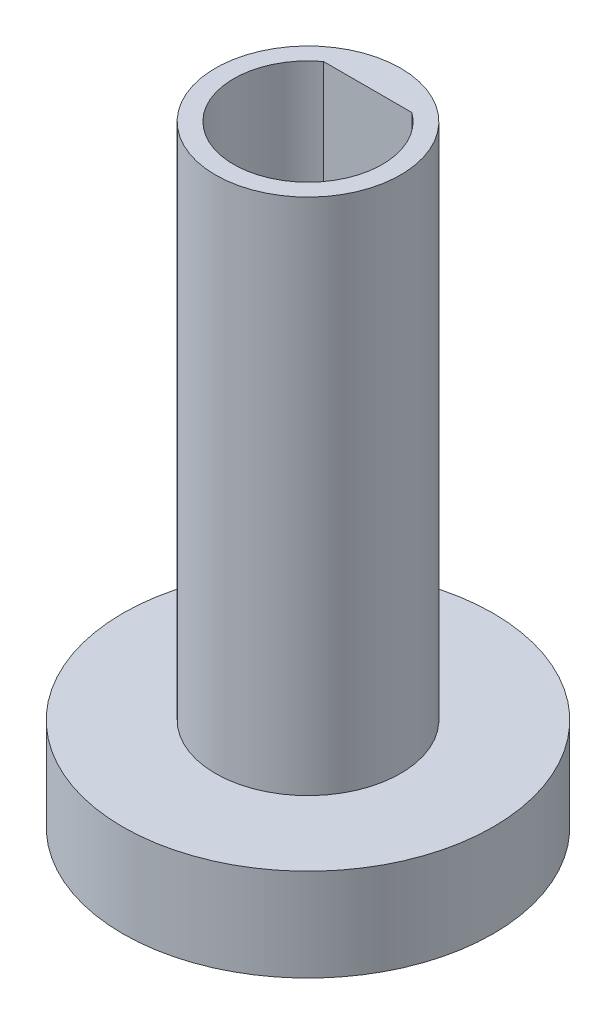
ISO-10303-21;
HEADER;
FILE_DESCRIPTION(('STEP AP214'),'2;1');
FILE_NAME('part.step','',(''),(''),'','','');
FILE_SCHEMA(('AUTOMOTIVE_DESIGN { 1 0 10303 214 1 1 1 1 }'));
ENDSEC;
DATA;
#1=APPLICATION_CONTEXT('core data for automotive mechanical design processes');
#2=APPLICATION_PROTOCOL_DEFINITION('international standard','automotive_design',2000,#1);
#3=PRODUCT_CONTEXT('',#1,'mechanical');
#4=PRODUCT('Part','Part','',(#3));
#5=PRODUCT_RELATED_PRODUCT_CATEGORY('part','',(#4));
#6=PRODUCT_DEFINITION_FORMATION('','',#4);
#7=PRODUCT_DEFINITION_CONTEXT('part definition',#1,'design');
#8=PRODUCT_DEFINITION('design','',#6,#7);
#9=PRODUCT_DEFINITION_SHAPE('','',#8);
#10=(LENGTH_UNIT() NAMED_UNIT(*) SI_UNIT(.MILLI.,.METRE.));
#11=(NAMED_UNIT(*) PLANE_ANGLE_UNIT() SI_UNIT($,.RADIAN.));
#12=(NAMED_UNIT(*) SI_UNIT($,.STERADIAN.) SOLID_ANGLE_UNIT());
#13=UNCERTAINTY_MEASURE_WITH_UNIT(LENGTH_MEASURE(1.E-05),#10,'distance_accuracy_value','');
#14=(GEOMETRIC_REPRESENTATION_CONTEXT(3) GLOBAL_UNCERTAINTY_ASSIGNED_CONTEXT((#13)) GLOBAL_UNIT_ASSIGNED_CONTEXT((#10,
#11,#12)) REPRESENTATION_CONTEXT('',''));
#15=CARTESIAN_POINT('',(0.,0.,0.));
#16=DIRECTION('',(0.,0.,1.));
#17=DIRECTION('',(1.,0.,0.));
#18=AXIS2_PLACEMENT_3D('',#15,#16,#17);
#19=CARTESIAN_POINT('',(0.,3.175,0.));
#20=DIRECTION('',(0.,-1.,0.));
#21=DIRECTION('',(0.,0.,-1.));
#22=AXIS2_PLACEMENT_3D('',#19,#20,#21);
#23=CYLINDRICAL_SURFACE('',#22,6.35);
#24=CARTESIAN_POINT('',(0.,3.175,0.));
#25=DIRECTION('',(0.,1.,0.));
#26=DIRECTION('',(0.,0.,1.));
#27=AXIS2_PLACEMENT_3D('',#24,#25,#26);
#28=CIRCLE('',#27,6.35);
#29=CARTESIAN_POINT('',(0.,3.175,6.35));
#30=VERTEX_POINT('',#29);
#31=EDGE_CURVE('E48',#30,#30,#28,.T.);
#32=ORIENTED_EDGE('',*,*,#31,.F.);
#33=EDGE_LOOP('',(#32));
#34=FACE_BOUND('',#33,.T.);
#35=CARTESIAN_POINT('',(0.,0.,0.));
#36=DIRECTION('',(0.,1.,0.));
#37=DIRECTION('',(0.,0.,1.));
#38=AXIS2_PLACEMENT_3D('',#35,#36,#37);
#39=CIRCLE('',#38,6.35);
#40=CARTESIAN_POINT('',(0.,0.,6.35));
#41=VERTEX_POINT('',#40);
#42=EDGE_CURVE('E99',#41,#41,#39,.T.);
#43=ORIENTED_EDGE('',*,*,#42,.T.);
#44=EDGE_LOOP('',(#43));
#45=FACE_BOUND('',#44,.T.);
#46=ADVANCED_FACE('F39',(#34,#45),#23,.T.);
#47=CARTESIAN_POINT('',(0.,3.175,0.));
#48=DIRECTION('',(0.,1.,0.));
#49=DIRECTION('',(0.,0.,1.));
#50=AXIS2_PLACEMENT_3D('',#47,#48,#49);
#51=PLANE('',#50);
#52=CARTESIAN_POINT('',(0.,3.175,0.));
#53=DIRECTION('',(0.,1.,0.));
#54=DIRECTION('',(0.,0.,1.));
#55=AXIS2_PLACEMENT_3D('',#52,#53,#54);
#56=CIRCLE('',#55,3.175);
#57=CARTESIAN_POINT('',(0.,3.175,3.175));
#58=VERTEX_POINT('',#57);
#59=EDGE_CURVE('E11',#58,#58,#56,.T.);
#60=ORIENTED_EDGE('',*,*,#59,.F.);
#61=EDGE_LOOP('',(#60));
#62=FACE_BOUND('',#61,.T.);
#63=ORIENTED_EDGE('',*,*,#31,.T.);
#64=EDGE_LOOP('',(#63));
#65=FACE_BOUND('',#64,.T.);
#66=ADVANCED_FACE('F111',(#62,#65),#51,.T.);
#67=CARTESIAN_POINT('',(0.,0.,0.));
#68=DIRECTION('',(0.,1.,0.));
#69=DIRECTION('',(0.,0.,1.));
#70=AXIS2_PLACEMENT_3D('',#67,#68,#69);
#71=PLANE('',#70);
#72=CARTESIAN_POINT('',(0.,0.,0.));
#73=DIRECTION('',(0.,-1.,0.));
#74=DIRECTION('',(0.,0.,-1.));
#75=AXIS2_PLACEMENT_3D('',#72,#73,#74);
#76=CIRCLE('',#75,0.762);
#77=CARTESIAN_POINT('',(0.,0.,-0.762));
#78=VERTEX_POINT('',#77);
#79=EDGE_CURVE('E88',#78,#78,#76,.T.);
#80=ORIENTED_EDGE('',*,*,#79,.F.);
#81=EDGE_LOOP('',(#80));
#82=FACE_BOUND('',#81,.T.);
#83=ORIENTED_EDGE('',*,*,#42,.F.);
#84=EDGE_LOOP('',(#83));
#85=FACE_BOUND('',#84,.T.);
#86=ADVANCED_FACE('F108',(#82,#85),#71,.F.);
#87=CARTESIAN_POINT('',(0.,20.955,0.));
#88=DIRECTION('',(0.,-1.,0.));
#89=DIRECTION('',(0.,0.,-1.));
#90=AXIS2_PLACEMENT_3D('',#87,#88,#89);
#91=CYLINDRICAL_SURFACE('',#90,3.175);
#92=CARTESIAN_POINT('',(0.,20.955,0.));
#93=DIRECTION('',(0.,1.,0.));
#94=DIRECTION('',(0.,0.,1.));
#95=AXIS2_PLACEMENT_3D('',#92,#93,#94);
#96=CIRCLE('',#95,3.175);
#97=CARTESIAN_POINT('',(0.,20.955,3.175));
#98=VERTEX_POINT('',#97);
#99=EDGE_CURVE('E96',#98,#98,#96,.T.);
#100=ORIENTED_EDGE('',*,*,#99,.F.);
#101=EDGE_LOOP('',(#100));
#102=FACE_BOUND('',#101,.T.);
#103=ORIENTED_EDGE('',*,*,#59,.T.);
#104=EDGE_LOOP('',(#103));
#105=FACE_BOUND('',#104,.T.);
#106=ADVANCED_FACE('F110',(#102,#105),#91,.T.);
#107=CARTESIAN_POINT('',(0.,20.955,0.));
#108=DIRECTION('',(0.,1.,0.));
#109=DIRECTION('',(0.,0.,1.));
#110=AXIS2_PLACEMENT_3D('',#107,#108,#109);
#111=PLANE('',#110);
#112=CARTESIAN_POINT('',(0.,20.955,0.));
#113=DIRECTION('',(0.,1.,0.));
#114=DIRECTION('',(0.,0.,1.));
#115=AXIS2_PLACEMENT_3D('',#112,#113,#114);
#116=CIRCLE('',#115,2.55);
#117=CARTESIAN_POINT('',(-1.51657508881031,20.955,-2.05));
#118=VERTEX_POINT('',#117);
#119=CARTESIAN_POINT('',(1.51657508881031,20.955,-2.05));
#120=VERTEX_POINT('',#119);
#121=EDGE_CURVE('E56',#118,#120,#116,.T.);
#122=ORIENTED_EDGE('',*,*,#121,.F.);
#123=DIRECTION('',(-1.,0.,0.));
#124=VECTOR('',#123,1.);
#125=CARTESIAN_POINT('',(-1.51657508881031,20.955,-2.05));
#126=LINE('',#125,#124);
#127=EDGE_CURVE('E77',#120,#118,#126,.T.);
#128=ORIENTED_EDGE('',*,*,#127,.F.);
#129=EDGE_LOOP('',(#122,#128));
#130=FACE_BOUND('',#129,.T.);
#131=ORIENTED_EDGE('',*,*,#99,.T.);
#132=EDGE_LOOP('',(#131));
#133=FACE_BOUND('',#132,.T.);
#134=ADVANCED_FACE('F82',(#130,#133),#111,.T.);
#135=CARTESIAN_POINT('',(0.,-3.69304193347711,0.));
#136=DIRECTION('',(0.,1.,0.));
#137=DIRECTION('',(0.,0.,1.));
#138=AXIS2_PLACEMENT_3D('',#135,#136,#137);
#139=CYLINDRICAL_SURFACE('',#138,2.55);
#140=CARTESIAN_POINT('',(0.,3.175,0.));
#141=DIRECTION('',(0.,1.,0.));
#142=DIRECTION('',(0.,0.,1.));
#143=AXIS2_PLACEMENT_3D('',#140,#141,#142);
#144=CIRCLE('',#143,2.55);
#145=CARTESIAN_POINT('',(1.51657508881031,3.175,-2.05));
#146=VERTEX_POINT('',#145);
#147=CARTESIAN_POINT('',(-1.51657508881031,3.175,-2.05));
#148=VERTEX_POINT('',#147);
#149=EDGE_CURVE('E72',#146,#148,#144,.F.);
#150=ORIENTED_EDGE('',*,*,#149,.T.);
#151=DIRECTION('',(0.,1.,0.));
#152=VECTOR('',#151,1.);
#153=CARTESIAN_POINT('',(-1.51657508881031,-3.69304193347711,-2.05));
#154=LINE('',#153,#152);
#155=EDGE_CURVE('E69',#148,#118,#154,.T.);
#156=ORIENTED_EDGE('',*,*,#155,.T.);
#157=ORIENTED_EDGE('',*,*,#121,.T.);
#158=DIRECTION('',(0.,1.,0.));
#159=VECTOR('',#158,1.);
#160=CARTESIAN_POINT('',(1.51657508881031,-3.69304193347711,-2.05));
#161=LINE('',#160,#159);
#162=EDGE_CURVE('E74',#146,#120,#161,.T.);
#163=ORIENTED_EDGE('',*,*,#162,.F.);
#164=EDGE_LOOP('',(#150,#156,#157,#163));
#165=FACE_BOUND('',#164,.T.);
#166=ADVANCED_FACE('F71',(#165),#139,.F.);
#167=CARTESIAN_POINT('',(-1.51657508881031,-3.69304193347711,-2.05));
#168=DIRECTION('',(0.,0.,-1.));
#169=DIRECTION('',(-1.,0.,0.));
#170=AXIS2_PLACEMENT_3D('',#167,#168,#169);
#171=PLANE('',#170);
#172=DIRECTION('',(1.,0.,0.));
#173=VECTOR('',#172,1.);
#174=CARTESIAN_POINT('',(-1.51657508881031,3.175,-2.05));
#175=LINE('',#174,#173);
#176=EDGE_CURVE('E63',#148,#146,#175,.T.);
#177=ORIENTED_EDGE('',*,*,#176,.T.);
#178=ORIENTED_EDGE('',*,*,#162,.T.);
#179=ORIENTED_EDGE('',*,*,#127,.T.);
#180=ORIENTED_EDGE('',*,*,#155,.F.);
#181=EDGE_LOOP('',(#177,#178,#179,#180));
#182=FACE_BOUND('',#181,.T.);
#183=ADVANCED_FACE('F78',(#182),#171,.F.);
#184=CARTESIAN_POINT('',(0.,3.175,0.));
#185=DIRECTION('',(0.,1.,0.));
#186=DIRECTION('',(0.,0.,1.));
#187=AXIS2_PLACEMENT_3D('',#184,#185,#186);
#188=PLANE('',#187);
#189=CARTESIAN_POINT('',(0.,3.175,0.));
#190=DIRECTION('',(0.,1.,0.));
#191=DIRECTION('',(0.,0.,1.));
#192=AXIS2_PLACEMENT_3D('',#189,#190,#191);
#193=CIRCLE('',#192,0.762);
#194=CARTESIAN_POINT('',(0.,3.175,0.762));
#195=VERTEX_POINT('',#194);
#196=EDGE_CURVE('E42',#195,#195,#193,.T.);
#197=ORIENTED_EDGE('',*,*,#196,.F.);
#198=EDGE_LOOP('',(#197));
#199=FACE_BOUND('',#198,.T.);
#200=ORIENTED_EDGE('',*,*,#149,.F.);
#201=ORIENTED_EDGE('',*,*,#176,.F.);
#202=EDGE_LOOP('',(#200,#201));
#203=FACE_BOUND('',#202,.T.);
#204=ADVANCED_FACE('F163',(#199,#203),#188,.T.);
#205=CARTESIAN_POINT('',(0.,20.955,0.));
#206=DIRECTION('',(0.,-1.,0.));
#207=DIRECTION('',(0.,0.,-1.));
#208=AXIS2_PLACEMENT_3D('',#205,#206,#207);
#209=CYLINDRICAL_SURFACE('',#208,0.762);
#210=ORIENTED_EDGE('',*,*,#196,.T.);
#211=EDGE_LOOP('',(#210));
#212=FACE_BOUND('',#211,.T.);
#213=ORIENTED_EDGE('',*,*,#79,.T.);
#214=EDGE_LOOP('',(#213));
#215=FACE_BOUND('',#214,.T.);
#216=ADVANCED_FACE('F176',(#212,#215),#209,.F.);
#217=CLOSED_SHELL('',(#46,#66,#86,#106,#134,#166,#183,#204,#216));
#218=MANIFOLD_SOLID_BREP('B2',#217);
#219=ADVANCED_BREP_SHAPE_REPRESENTATION('',(#18,#218),#14);
#220=SHAPE_DEFINITION_REPRESENTATION(#9,#219);
ENDSEC;
END-ISO-10303-21;
